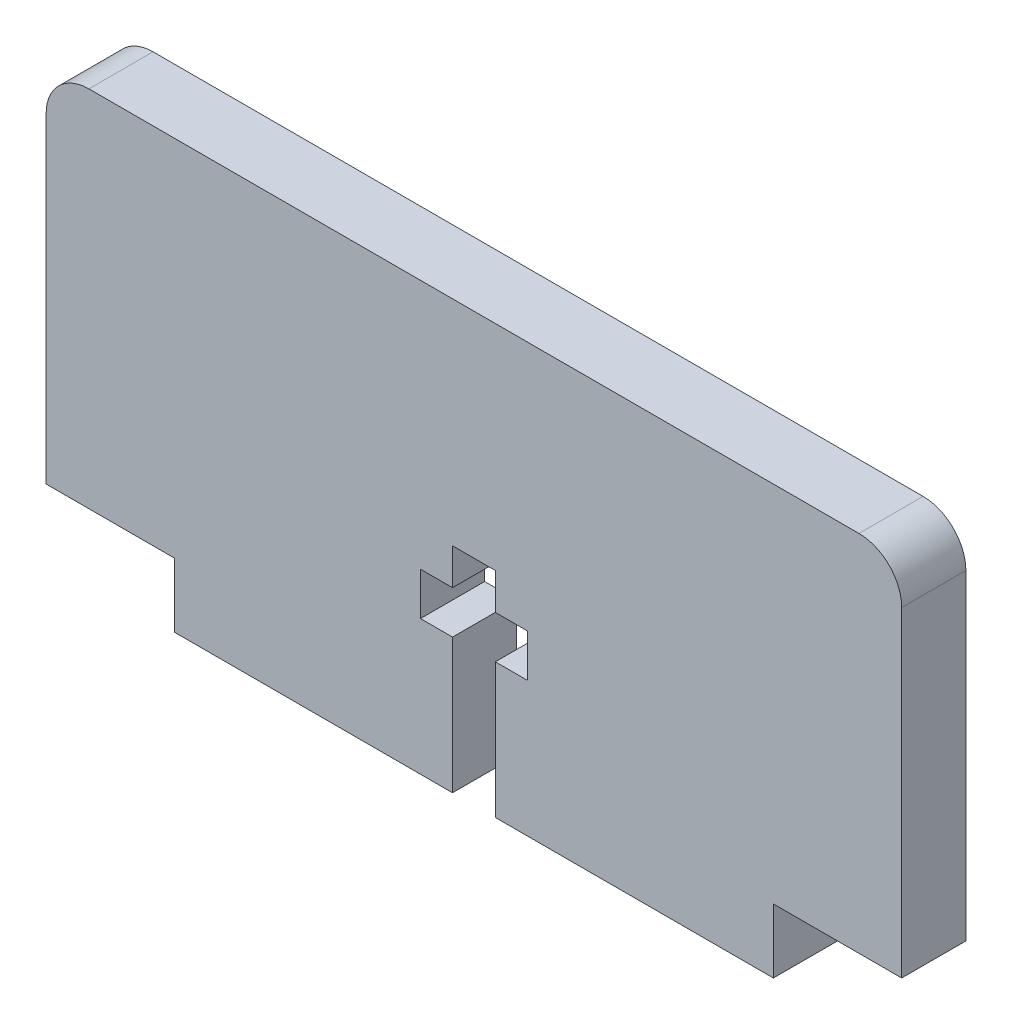
ISO-10303-21;
HEADER;
FILE_DESCRIPTION(('STEP AP214'),'2;1');
FILE_NAME('part.step','',(''),(''),'','','');
FILE_SCHEMA(('AUTOMOTIVE_DESIGN { 1 0 10303 214 1 1 1 1 }'));
ENDSEC;
DATA;
#1=APPLICATION_CONTEXT('core data for automotive mechanical design processes');
#2=APPLICATION_PROTOCOL_DEFINITION('international standard','automotive_design',2000,#1);
#3=PRODUCT_CONTEXT('',#1,'mechanical');
#4=PRODUCT('Part','Part','',(#3));
#5=PRODUCT_RELATED_PRODUCT_CATEGORY('part','',(#4));
#6=PRODUCT_DEFINITION_FORMATION('','',#4);
#7=PRODUCT_DEFINITION_CONTEXT('part definition',#1,'design');
#8=PRODUCT_DEFINITION('design','',#6,#7);
#9=PRODUCT_DEFINITION_SHAPE('','',#8);
#10=(LENGTH_UNIT() NAMED_UNIT(*) SI_UNIT(.MILLI.,.METRE.));
#11=(NAMED_UNIT(*) PLANE_ANGLE_UNIT() SI_UNIT($,.RADIAN.));
#12=(NAMED_UNIT(*) SI_UNIT($,.STERADIAN.) SOLID_ANGLE_UNIT());
#13=UNCERTAINTY_MEASURE_WITH_UNIT(LENGTH_MEASURE(1.E-05),#10,'distance_accuracy_value','');
#14=(GEOMETRIC_REPRESENTATION_CONTEXT(3) GLOBAL_UNCERTAINTY_ASSIGNED_CONTEXT((#13)) GLOBAL_UNIT_ASSIGNED_CONTEXT((#10,
#11,#12)) REPRESENTATION_CONTEXT('',''));
#15=CARTESIAN_POINT('',(0.,0.,0.));
#16=DIRECTION('',(0.,0.,1.));
#17=DIRECTION('',(1.,0.,0.));
#18=AXIS2_PLACEMENT_3D('',#15,#16,#17);
#19=CARTESIAN_POINT('',(-100.,0.,15.));
#20=DIRECTION('',(0.,1.,0.));
#21=DIRECTION('',(0.,0.,1.));
#22=AXIS2_PLACEMENT_3D('',#19,#20,#21);
#23=PLANE('',#22);
#24=DIRECTION('',(0.,0.,1.));
#25=VECTOR('',#24,1.);
#26=CARTESIAN_POINT('',(5.00000000000006,0.,0.));
#27=LINE('',#26,#25);
#28=CARTESIAN_POINT('',(5.00000000000006,0.,0.));
#29=VERTEX_POINT('',#28);
#30=CARTESIAN_POINT('',(5.00000000000006,0.,15.));
#31=VERTEX_POINT('',#30);
#32=EDGE_CURVE('E254',#29,#31,#27,.T.);
#33=ORIENTED_EDGE('',*,*,#32,.F.);
#34=DIRECTION('',(1.,0.,0.));
#35=VECTOR('',#34,1.);
#36=CARTESIAN_POINT('',(-100.,0.,0.));
#37=LINE('',#36,#35);
#38=CARTESIAN_POINT('',(70.,0.,0.));
#39=VERTEX_POINT('',#38);
#40=EDGE_CURVE('E340',#29,#39,#37,.T.);
#41=ORIENTED_EDGE('',*,*,#40,.T.);
#42=DIRECTION('',(0.,0.,1.));
#43=VECTOR('',#42,1.);
#44=CARTESIAN_POINT('',(70.,0.,0.));
#45=LINE('',#44,#43);
#46=CARTESIAN_POINT('',(70.,0.,15.));
#47=VERTEX_POINT('',#46);
#48=EDGE_CURVE('E235',#39,#47,#45,.T.);
#49=ORIENTED_EDGE('',*,*,#48,.T.);
#50=DIRECTION('',(1.,0.,0.));
#51=VECTOR('',#50,1.);
#52=CARTESIAN_POINT('',(-100.,0.,15.));
#53=LINE('',#52,#51);
#54=EDGE_CURVE('E324',#31,#47,#53,.T.);
#55=ORIENTED_EDGE('',*,*,#54,.F.);
#56=EDGE_LOOP('',(#33,#41,#49,#55));
#57=FACE_BOUND('',#56,.T.);
#58=ADVANCED_FACE('F56',(#57),#23,.F.);
#59=CARTESIAN_POINT('',(89.9999999999999,90.,15.));
#60=DIRECTION('',(0.,0.,1.));
#61=DIRECTION('',(1.,0.,0.));
#62=AXIS2_PLACEMENT_3D('',#59,#60,#61);
#63=PLANE('',#62);
#64=DIRECTION('',(0.,-1.,0.));
#65=VECTOR('',#64,1.);
#66=CARTESIAN_POINT('',(-4.99999999999995,50.,15.));
#67=LINE('',#66,#65);
#68=CARTESIAN_POINT('',(-4.99999999999994,31.5158472255241,15.));
#69=VERTEX_POINT('',#68);
#70=CARTESIAN_POINT('',(-4.99999999999994,0.,15.));
#71=VERTEX_POINT('',#70);
#72=EDGE_CURVE('E265',#69,#71,#67,.T.);
#73=ORIENTED_EDGE('',*,*,#72,.F.);
#74=DIRECTION('',(1.,0.,0.));
#75=VECTOR('',#74,1.);
#76=CARTESIAN_POINT('',(-12.4999999999999,31.5158472255241,15.));
#77=LINE('',#76,#75);
#78=CARTESIAN_POINT('',(-12.4999999999999,31.5158472255241,15.));
#79=VERTEX_POINT('',#78);
#80=EDGE_CURVE('E231',#79,#69,#77,.T.);
#81=ORIENTED_EDGE('',*,*,#80,.F.);
#82=DIRECTION('',(0.,-1.,0.));
#83=VECTOR('',#82,1.);
#84=CARTESIAN_POINT('',(-12.4999999999999,41.5158472255241,15.));
#85=LINE('',#84,#83);
#86=CARTESIAN_POINT('',(-12.4999999999999,41.5158472255241,15.));
#87=VERTEX_POINT('',#86);
#88=EDGE_CURVE('E209',#87,#79,#85,.T.);
#89=ORIENTED_EDGE('',*,*,#88,.F.);
#90=DIRECTION('',(1.,0.,0.));
#91=VECTOR('',#90,1.);
#92=CARTESIAN_POINT('',(-12.4999999999999,41.5158472255241,15.));
#93=LINE('',#92,#91);
#94=CARTESIAN_POINT('',(-4.99999999999995,41.5158472255241,15.));
#95=VERTEX_POINT('',#94);
#96=EDGE_CURVE('E220',#87,#95,#93,.T.);
#97=ORIENTED_EDGE('',*,*,#96,.T.);
#98=CARTESIAN_POINT('',(-4.99999999999995,50.,15.));
#99=VERTEX_POINT('',#98);
#100=EDGE_CURVE('E263',#99,#95,#67,.T.);
#101=ORIENTED_EDGE('',*,*,#100,.F.);
#102=DIRECTION('',(1.,0.,0.));
#103=VECTOR('',#102,1.);
#104=CARTESIAN_POINT('',(-4.99999999999995,50.,15.));
#105=LINE('',#104,#103);
#106=CARTESIAN_POINT('',(5.00000000000005,50.,15.));
#107=VERTEX_POINT('',#106);
#108=EDGE_CURVE('E217',#99,#107,#105,.T.);
#109=ORIENTED_EDGE('',*,*,#108,.T.);
#110=DIRECTION('',(0.,-1.,0.));
#111=VECTOR('',#110,1.);
#112=CARTESIAN_POINT('',(5.00000000000005,50.,15.));
#113=LINE('',#112,#111);
#114=CARTESIAN_POINT('',(5.00000000000005,41.5158472255241,15.));
#115=VERTEX_POINT('',#114);
#116=EDGE_CURVE('E267',#107,#115,#113,.T.);
#117=ORIENTED_EDGE('',*,*,#116,.T.);
#118=CARTESIAN_POINT('',(12.5000000000001,41.5158472255241,15.));
#119=VERTEX_POINT('',#118);
#120=EDGE_CURVE('E226',#115,#119,#93,.T.);
#121=ORIENTED_EDGE('',*,*,#120,.T.);
#122=DIRECTION('',(0.,-1.,0.));
#123=VECTOR('',#122,1.);
#124=CARTESIAN_POINT('',(12.5000000000001,41.5158472255241,15.));
#125=LINE('',#124,#123);
#126=CARTESIAN_POINT('',(12.5000000000001,31.5158472255241,15.));
#127=VERTEX_POINT('',#126);
#128=EDGE_CURVE('E389',#119,#127,#125,.T.);
#129=ORIENTED_EDGE('',*,*,#128,.T.);
#130=CARTESIAN_POINT('',(5.00000000000006,31.5158472255241,15.));
#131=VERTEX_POINT('',#130);
#132=EDGE_CURVE('E233',#131,#127,#77,.T.);
#133=ORIENTED_EDGE('',*,*,#132,.F.);
#134=EDGE_CURVE('E270',#131,#31,#113,.T.);
#135=ORIENTED_EDGE('',*,*,#134,.T.);
#136=ORIENTED_EDGE('',*,*,#54,.T.);
#137=DIRECTION('',(0.,-1.,0.));
#138=VECTOR('',#137,1.);
#139=CARTESIAN_POINT('',(70.,0.,15.));
#140=LINE('',#139,#138);
#141=CARTESIAN_POINT('',(70.,15.,15.));
#142=VERTEX_POINT('',#141);
#143=EDGE_CURVE('E285',#142,#47,#140,.T.);
#144=ORIENTED_EDGE('',*,*,#143,.F.);
#145=DIRECTION('',(1.,0.,0.));
#146=VECTOR('',#145,1.);
#147=CARTESIAN_POINT('',(0.,15.,15.));
#148=LINE('',#147,#146);
#149=CARTESIAN_POINT('',(100.,15.,15.));
#150=VERTEX_POINT('',#149);
#151=EDGE_CURVE('E288',#142,#150,#148,.T.);
#152=ORIENTED_EDGE('',*,*,#151,.T.);
#153=DIRECTION('',(0.,1.,0.));
#154=VECTOR('',#153,1.);
#155=CARTESIAN_POINT('',(100.,0.,15.));
#156=LINE('',#155,#154);
#157=CARTESIAN_POINT('',(99.9999999999999,90.,15.));
#158=VERTEX_POINT('',#157);
#159=EDGE_CURVE('E312',#150,#158,#156,.T.);
#160=ORIENTED_EDGE('',*,*,#159,.T.);
#161=CARTESIAN_POINT('',(89.9999999999999,90.,15.));
#162=DIRECTION('',(0.,0.,1.));
#163=DIRECTION('',(1.,0.,0.));
#164=AXIS2_PLACEMENT_3D('',#161,#162,#163);
#165=CIRCLE('',#164,9.99999999999999);
#166=CARTESIAN_POINT('',(89.9999999999999,100.,15.));
#167=VERTEX_POINT('',#166);
#168=EDGE_CURVE('E314',#158,#167,#165,.T.);
#169=ORIENTED_EDGE('',*,*,#168,.T.);
#170=DIRECTION('',(-1.,0.,0.));
#171=VECTOR('',#170,1.);
#172=CARTESIAN_POINT('',(89.9999999999999,100.,15.));
#173=LINE('',#172,#171);
#174=CARTESIAN_POINT('',(-89.9999999999999,100.,15.));
#175=VERTEX_POINT('',#174);
#176=EDGE_CURVE('E317',#167,#175,#173,.T.);
#177=ORIENTED_EDGE('',*,*,#176,.T.);
#178=CARTESIAN_POINT('',(-89.9999999999999,90.,15.));
#179=DIRECTION('',(0.,0.,1.));
#180=DIRECTION('',(-1.,0.,0.));
#181=AXIS2_PLACEMENT_3D('',#178,#179,#180);
#182=CIRCLE('',#181,9.99999999999999);
#183=CARTESIAN_POINT('',(-99.9999999999999,90.,15.));
#184=VERTEX_POINT('',#183);
#185=EDGE_CURVE('E319',#175,#184,#182,.T.);
#186=ORIENTED_EDGE('',*,*,#185,.T.);
#187=DIRECTION('',(0.,-1.,0.));
#188=VECTOR('',#187,1.);
#189=CARTESIAN_POINT('',(-99.9999999999999,75.4145188432739,15.));
#190=LINE('',#189,#188);
#191=CARTESIAN_POINT('',(-99.9999999999999,15.,15.));
#192=VERTEX_POINT('',#191);
#193=EDGE_CURVE('E321',#184,#192,#190,.T.);
#194=ORIENTED_EDGE('',*,*,#193,.T.);
#195=DIRECTION('',(-1.,0.,0.));
#196=VECTOR('',#195,1.);
#197=CARTESIAN_POINT('',(0.,15.,15.));
#198=LINE('',#197,#196);
#199=CARTESIAN_POINT('',(-69.9999999999999,15.,15.));
#200=VERTEX_POINT('',#199);
#201=EDGE_CURVE('E298',#200,#192,#198,.T.);
#202=ORIENTED_EDGE('',*,*,#201,.F.);
#203=DIRECTION('',(0.,-1.,0.));
#204=VECTOR('',#203,1.);
#205=CARTESIAN_POINT('',(-69.9999999999999,0.,15.));
#206=LINE('',#205,#204);
#207=CARTESIAN_POINT('',(-69.9999999999999,0.,15.));
#208=VERTEX_POINT('',#207);
#209=EDGE_CURVE('E291',#200,#208,#206,.T.);
#210=ORIENTED_EDGE('',*,*,#209,.T.);
#211=EDGE_CURVE('E325',#208,#71,#53,.T.);
#212=ORIENTED_EDGE('',*,*,#211,.T.);
#213=EDGE_LOOP('',(#73,#81,#89,#97,#101,#109,#117,#121,#129,#133,#135,#136,#144,#152,#160,#169,
#177,#186,#194,#202,#210,#212));
#214=FACE_BOUND('',#213,.T.);
#215=ADVANCED_FACE('F229',(#214),#63,.T.);
#216=CARTESIAN_POINT('',(89.9999999999999,90.,0.));
#217=DIRECTION('',(0.,0.,1.));
#218=DIRECTION('',(1.,0.,0.));
#219=AXIS2_PLACEMENT_3D('',#216,#217,#218);
#220=PLANE('',#219);
#221=DIRECTION('',(1.,0.,0.));
#222=VECTOR('',#221,1.);
#223=CARTESIAN_POINT('',(-12.4999999999999,31.5158472255241,0.));
#224=LINE('',#223,#222);
#225=CARTESIAN_POINT('',(-12.4999999999999,31.5158472255241,0.));
#226=VERTEX_POINT('',#225);
#227=CARTESIAN_POINT('',(-4.99999999999994,31.5158472255241,0.));
#228=VERTEX_POINT('',#227);
#229=EDGE_CURVE('E246',#226,#228,#224,.T.);
#230=ORIENTED_EDGE('',*,*,#229,.T.);
#231=DIRECTION('',(0.,-1.,0.));
#232=VECTOR('',#231,1.);
#233=CARTESIAN_POINT('',(-4.99999999999995,50.,0.));
#234=LINE('',#233,#232);
#235=CARTESIAN_POINT('',(-4.99999999999994,0.,0.));
#236=VERTEX_POINT('',#235);
#237=EDGE_CURVE('E275',#228,#236,#234,.T.);
#238=ORIENTED_EDGE('',*,*,#237,.T.);
#239=CARTESIAN_POINT('',(-69.9999999999999,0.,0.));
#240=VERTEX_POINT('',#239);
#241=EDGE_CURVE('E315',#240,#236,#37,.T.);
#242=ORIENTED_EDGE('',*,*,#241,.F.);
#243=DIRECTION('',(0.,-1.,0.));
#244=VECTOR('',#243,1.);
#245=CARTESIAN_POINT('',(-69.9999999999999,0.,0.));
#246=LINE('',#245,#244);
#247=CARTESIAN_POINT('',(-69.9999999999999,15.,0.));
#248=VERTEX_POINT('',#247);
#249=EDGE_CURVE('E295',#248,#240,#246,.T.);
#250=ORIENTED_EDGE('',*,*,#249,.F.);
#251=DIRECTION('',(-1.,0.,0.));
#252=VECTOR('',#251,1.);
#253=CARTESIAN_POINT('',(0.,15.,0.));
#254=LINE('',#253,#252);
#255=CARTESIAN_POINT('',(-100.,15.,0.));
#256=VERTEX_POINT('',#255);
#257=EDGE_CURVE('E297',#248,#256,#254,.T.);
#258=ORIENTED_EDGE('',*,*,#257,.T.);
#259=DIRECTION('',(0.,-1.,0.));
#260=VECTOR('',#259,1.);
#261=CARTESIAN_POINT('',(-100.,0.,0.));
#262=LINE('',#261,#260);
#263=CARTESIAN_POINT('',(-99.9999999999999,90.,0.));
#264=VERTEX_POINT('',#263);
#265=EDGE_CURVE('E337',#264,#256,#262,.T.);
#266=ORIENTED_EDGE('',*,*,#265,.F.);
#267=CARTESIAN_POINT('',(-89.9999999999999,90.,0.));
#268=DIRECTION('',(0.,0.,1.));
#269=DIRECTION('',(-1.,0.,0.));
#270=AXIS2_PLACEMENT_3D('',#267,#268,#269);
#271=CIRCLE('',#270,9.99999999999999);
#272=CARTESIAN_POINT('',(-89.9999999999999,100.,0.));
#273=VERTEX_POINT('',#272);
#274=EDGE_CURVE('E334',#273,#264,#271,.T.);
#275=ORIENTED_EDGE('',*,*,#274,.F.);
#276=DIRECTION('',(-1.,0.,0.));
#277=VECTOR('',#276,1.);
#278=CARTESIAN_POINT('',(89.9999999999999,100.,0.));
#279=LINE('',#278,#277);
#280=CARTESIAN_POINT('',(89.9999999999999,100.,0.));
#281=VERTEX_POINT('',#280);
#282=EDGE_CURVE('E332',#281,#273,#279,.T.);
#283=ORIENTED_EDGE('',*,*,#282,.F.);
#284=CARTESIAN_POINT('',(89.9999999999999,90.,0.));
#285=DIRECTION('',(0.,0.,1.));
#286=DIRECTION('',(1.,0.,0.));
#287=AXIS2_PLACEMENT_3D('',#284,#285,#286);
#288=CIRCLE('',#287,9.99999999999999);
#289=CARTESIAN_POINT('',(99.9999999999999,90.,0.));
#290=VERTEX_POINT('',#289);
#291=EDGE_CURVE('E330',#290,#281,#288,.T.);
#292=ORIENTED_EDGE('',*,*,#291,.F.);
#293=DIRECTION('',(0.,1.,0.));
#294=VECTOR('',#293,1.);
#295=CARTESIAN_POINT('',(99.9999999999999,75.4145188432739,0.));
#296=LINE('',#295,#294);
#297=CARTESIAN_POINT('',(99.9999999999999,15.,0.));
#298=VERTEX_POINT('',#297);
#299=EDGE_CURVE('E307',#298,#290,#296,.T.);
#300=ORIENTED_EDGE('',*,*,#299,.F.);
#301=DIRECTION('',(1.,0.,0.));
#302=VECTOR('',#301,1.);
#303=CARTESIAN_POINT('',(0.,15.,0.));
#304=LINE('',#303,#302);
#305=CARTESIAN_POINT('',(70.,15.,0.));
#306=VERTEX_POINT('',#305);
#307=EDGE_CURVE('E79',#306,#298,#304,.T.);
#308=ORIENTED_EDGE('',*,*,#307,.F.);
#309=DIRECTION('',(0.,-1.,0.));
#310=VECTOR('',#309,1.);
#311=CARTESIAN_POINT('',(70.,0.,0.));
#312=LINE('',#311,#310);
#313=EDGE_CURVE('E282',#306,#39,#312,.T.);
#314=ORIENTED_EDGE('',*,*,#313,.T.);
#315=ORIENTED_EDGE('',*,*,#40,.F.);
#316=DIRECTION('',(0.,-1.,0.));
#317=VECTOR('',#316,1.);
#318=CARTESIAN_POINT('',(5.00000000000005,50.,0.));
#319=LINE('',#318,#317);
#320=CARTESIAN_POINT('',(5.00000000000006,31.5158472255241,0.));
#321=VERTEX_POINT('',#320);
#322=EDGE_CURVE('E71',#321,#29,#319,.T.);
#323=ORIENTED_EDGE('',*,*,#322,.F.);
#324=CARTESIAN_POINT('',(12.5000000000001,31.5158472255241,0.));
#325=VERTEX_POINT('',#324);
#326=EDGE_CURVE('E249',#321,#325,#224,.T.);
#327=ORIENTED_EDGE('',*,*,#326,.T.);
#328=DIRECTION('',(0.,-1.,0.));
#329=VECTOR('',#328,1.);
#330=CARTESIAN_POINT('',(12.5000000000001,41.5158472255241,0.));
#331=LINE('',#330,#329);
#332=CARTESIAN_POINT('',(12.5000000000001,41.5158472255241,0.));
#333=VERTEX_POINT('',#332);
#334=EDGE_CURVE('E244',#333,#325,#331,.T.);
#335=ORIENTED_EDGE('',*,*,#334,.F.);
#336=DIRECTION('',(1.,0.,0.));
#337=VECTOR('',#336,1.);
#338=CARTESIAN_POINT('',(-12.4999999999999,41.5158472255241,0.));
#339=LINE('',#338,#337);
#340=CARTESIAN_POINT('',(5.00000000000005,41.5158472255241,0.));
#341=VERTEX_POINT('',#340);
#342=EDGE_CURVE('E242',#341,#333,#339,.T.);
#343=ORIENTED_EDGE('',*,*,#342,.F.);
#344=CARTESIAN_POINT('',(5.00000000000005,50.,0.));
#345=VERTEX_POINT('',#344);
#346=EDGE_CURVE('E276',#345,#341,#319,.T.);
#347=ORIENTED_EDGE('',*,*,#346,.F.);
#348=DIRECTION('',(1.,0.,0.));
#349=VECTOR('',#348,1.);
#350=CARTESIAN_POINT('',(-4.99999999999995,50.,0.));
#351=LINE('',#350,#349);
#352=CARTESIAN_POINT('',(-4.99999999999995,50.,0.));
#353=VERTEX_POINT('',#352);
#354=EDGE_CURVE('E266',#353,#345,#351,.T.);
#355=ORIENTED_EDGE('',*,*,#354,.F.);
#356=CARTESIAN_POINT('',(-4.99999999999995,41.5158472255241,0.));
#357=VERTEX_POINT('',#356);
#358=EDGE_CURVE('E262',#353,#357,#234,.T.);
#359=ORIENTED_EDGE('',*,*,#358,.T.);
#360=CARTESIAN_POINT('',(-12.4999999999999,41.5158472255241,0.));
#361=VERTEX_POINT('',#360);
#362=EDGE_CURVE('E240',#361,#357,#339,.T.);
#363=ORIENTED_EDGE('',*,*,#362,.F.);
#364=DIRECTION('',(0.,-1.,0.));
#365=VECTOR('',#364,1.);
#366=CARTESIAN_POINT('',(-12.4999999999999,41.5158472255241,0.));
#367=LINE('',#366,#365);
#368=EDGE_CURVE('E212',#361,#226,#367,.T.);
#369=ORIENTED_EDGE('',*,*,#368,.T.);
#370=EDGE_LOOP('',(#230,#238,#242,#250,#258,#266,#275,#283,#292,#300,#308,#314,#315,#323,#327,
#335,#343,#347,#355,#359,#363,#369));
#371=FACE_BOUND('',#370,.T.);
#372=ADVANCED_FACE('F359',(#371),#220,.F.);
#373=CARTESIAN_POINT('',(99.9999999999999,75.4145188432739,15.));
#374=DIRECTION('',(-1.,0.,0.));
#375=DIRECTION('',(0.,0.,1.));
#376=AXIS2_PLACEMENT_3D('',#373,#374,#375);
#377=PLANE('',#376);
#378=DIRECTION('',(0.,0.,1.));
#379=VECTOR('',#378,1.);
#380=CARTESIAN_POINT('',(100.,15.,0.));
#381=LINE('',#380,#379);
#382=EDGE_CURVE('E232',#298,#150,#381,.T.);
#383=ORIENTED_EDGE('',*,*,#382,.F.);
#384=ORIENTED_EDGE('',*,*,#299,.T.);
#385=DIRECTION('',(0.,0.,-1.));
#386=VECTOR('',#385,1.);
#387=CARTESIAN_POINT('',(99.9999999999999,90.,15.));
#388=LINE('',#387,#386);
#389=EDGE_CURVE('E12',#158,#290,#388,.T.);
#390=ORIENTED_EDGE('',*,*,#389,.F.);
#391=ORIENTED_EDGE('',*,*,#159,.F.);
#392=EDGE_LOOP('',(#383,#384,#390,#391));
#393=FACE_BOUND('',#392,.T.);
#394=ADVANCED_FACE('F58',(#393),#377,.F.);
#395=ORIENTED_EDGE('',*,*,#241,.T.);
#396=DIRECTION('',(0.,0.,1.));
#397=VECTOR('',#396,1.);
#398=CARTESIAN_POINT('',(-4.99999999999994,0.,0.));
#399=LINE('',#398,#397);
#400=EDGE_CURVE('E257',#236,#71,#399,.T.);
#401=ORIENTED_EDGE('',*,*,#400,.T.);
#402=ORIENTED_EDGE('',*,*,#211,.F.);
#403=DIRECTION('',(0.,0.,1.));
#404=VECTOR('',#403,1.);
#405=CARTESIAN_POINT('',(-69.9999999999999,0.,0.));
#406=LINE('',#405,#404);
#407=EDGE_CURVE('E305',#240,#208,#406,.T.);
#408=ORIENTED_EDGE('',*,*,#407,.F.);
#409=EDGE_LOOP('',(#395,#401,#402,#408));
#410=FACE_BOUND('',#409,.T.);
#411=ADVANCED_FACE('F432',(#410),#23,.F.);
#412=CARTESIAN_POINT('',(89.9999999999999,90.,15.));
#413=DIRECTION('',(0.,0.,-1.));
#414=DIRECTION('',(-1.,0.,0.));
#415=AXIS2_PLACEMENT_3D('',#412,#413,#414);
#416=CYLINDRICAL_SURFACE('',#415,9.99999999999999);
#417=ORIENTED_EDGE('',*,*,#291,.T.);
#418=DIRECTION('',(0.,0.,-1.));
#419=VECTOR('',#418,1.);
#420=CARTESIAN_POINT('',(89.9999999999999,100.,15.));
#421=LINE('',#420,#419);
#422=EDGE_CURVE('E64',#167,#281,#421,.T.);
#423=ORIENTED_EDGE('',*,*,#422,.F.);
#424=ORIENTED_EDGE('',*,*,#168,.F.);
#425=ORIENTED_EDGE('',*,*,#389,.T.);
#426=EDGE_LOOP('',(#417,#423,#424,#425));
#427=FACE_BOUND('',#426,.T.);
#428=ADVANCED_FACE('F371',(#427),#416,.T.);
#429=CARTESIAN_POINT('',(89.9999999999999,100.,15.));
#430=DIRECTION('',(0.,-1.,0.));
#431=DIRECTION('',(0.,0.,-1.));
#432=AXIS2_PLACEMENT_3D('',#429,#430,#431);
#433=PLANE('',#432);
#434=ORIENTED_EDGE('',*,*,#282,.T.);
#435=DIRECTION('',(0.,0.,-1.));
#436=VECTOR('',#435,1.);
#437=CARTESIAN_POINT('',(-89.9999999999999,100.,15.));
#438=LINE('',#437,#436);
#439=EDGE_CURVE('E345',#175,#273,#438,.T.);
#440=ORIENTED_EDGE('',*,*,#439,.F.);
#441=ORIENTED_EDGE('',*,*,#176,.F.);
#442=ORIENTED_EDGE('',*,*,#422,.T.);
#443=EDGE_LOOP('',(#434,#440,#441,#442));
#444=FACE_BOUND('',#443,.T.);
#445=ADVANCED_FACE('F352',(#444),#433,.F.);
#446=CARTESIAN_POINT('',(-89.9999999999999,90.,15.));
#447=DIRECTION('',(0.,0.,-1.));
#448=DIRECTION('',(-1.,0.,0.));
#449=AXIS2_PLACEMENT_3D('',#446,#447,#448);
#450=CYLINDRICAL_SURFACE('',#449,9.99999999999999);
#451=ORIENTED_EDGE('',*,*,#274,.T.);
#452=DIRECTION('',(0.,0.,-1.));
#453=VECTOR('',#452,1.);
#454=CARTESIAN_POINT('',(-99.9999999999999,90.,15.));
#455=LINE('',#454,#453);
#456=EDGE_CURVE('E328',#184,#264,#455,.T.);
#457=ORIENTED_EDGE('',*,*,#456,.F.);
#458=ORIENTED_EDGE('',*,*,#185,.F.);
#459=ORIENTED_EDGE('',*,*,#439,.T.);
#460=EDGE_LOOP('',(#451,#457,#458,#459));
#461=FACE_BOUND('',#460,.T.);
#462=ADVANCED_FACE('F363',(#461),#450,.T.);
#463=CARTESIAN_POINT('',(-100.,0.,15.));
#464=DIRECTION('',(1.,0.,0.));
#465=DIRECTION('',(0.,0.,-1.));
#466=AXIS2_PLACEMENT_3D('',#463,#464,#465);
#467=PLANE('',#466);
#468=ORIENTED_EDGE('',*,*,#265,.T.);
#469=DIRECTION('',(0.,0.,1.));
#470=VECTOR('',#469,1.);
#471=CARTESIAN_POINT('',(-99.9999999999999,15.,0.));
#472=LINE('',#471,#470);
#473=EDGE_CURVE('E308',#256,#192,#472,.T.);
#474=ORIENTED_EDGE('',*,*,#473,.T.);
#475=ORIENTED_EDGE('',*,*,#193,.F.);
#476=ORIENTED_EDGE('',*,*,#456,.T.);
#477=EDGE_LOOP('',(#468,#474,#475,#476));
#478=FACE_BOUND('',#477,.T.);
#479=ADVANCED_FACE('F367',(#478),#467,.F.);
#480=CARTESIAN_POINT('',(-69.9999999999999,0.,0.));
#481=DIRECTION('',(-1.,0.,0.));
#482=DIRECTION('',(0.,0.,1.));
#483=AXIS2_PLACEMENT_3D('',#480,#481,#482);
#484=PLANE('',#483);
#485=ORIENTED_EDGE('',*,*,#209,.F.);
#486=DIRECTION('',(0.,0.,1.));
#487=VECTOR('',#486,1.);
#488=CARTESIAN_POINT('',(-69.9999999999999,15.,0.));
#489=LINE('',#488,#487);
#490=EDGE_CURVE('E301',#248,#200,#489,.T.);
#491=ORIENTED_EDGE('',*,*,#490,.F.);
#492=ORIENTED_EDGE('',*,*,#249,.T.);
#493=ORIENTED_EDGE('',*,*,#407,.T.);
#494=EDGE_LOOP('',(#485,#491,#492,#493));
#495=FACE_BOUND('',#494,.T.);
#496=ADVANCED_FACE('F436',(#495),#484,.T.);
#497=CARTESIAN_POINT('',(0.,15.,0.));
#498=DIRECTION('',(0.,1.,0.));
#499=DIRECTION('',(-1.,0.,0.));
#500=AXIS2_PLACEMENT_3D('',#497,#498,#499);
#501=PLANE('',#500);
#502=ORIENTED_EDGE('',*,*,#201,.T.);
#503=ORIENTED_EDGE('',*,*,#473,.F.);
#504=ORIENTED_EDGE('',*,*,#257,.F.);
#505=ORIENTED_EDGE('',*,*,#490,.T.);
#506=EDGE_LOOP('',(#502,#503,#504,#505));
#507=FACE_BOUND('',#506,.T.);
#508=ADVANCED_FACE('F440',(#507),#501,.F.);
#509=CARTESIAN_POINT('',(0.,15.,0.));
#510=DIRECTION('',(0.,-1.,0.));
#511=DIRECTION('',(1.,0.,0.));
#512=AXIS2_PLACEMENT_3D('',#509,#510,#511);
#513=PLANE('',#512);
#514=ORIENTED_EDGE('',*,*,#151,.F.);
#515=DIRECTION('',(0.,0.,1.));
#516=VECTOR('',#515,1.);
#517=CARTESIAN_POINT('',(70.,15.,0.));
#518=LINE('',#517,#516);
#519=EDGE_CURVE('E280',#306,#142,#518,.T.);
#520=ORIENTED_EDGE('',*,*,#519,.F.);
#521=ORIENTED_EDGE('',*,*,#307,.T.);
#522=ORIENTED_EDGE('',*,*,#382,.T.);
#523=EDGE_LOOP('',(#514,#520,#521,#522));
#524=FACE_BOUND('',#523,.T.);
#525=ADVANCED_FACE('F442',(#524),#513,.T.);
#526=CARTESIAN_POINT('',(70.,0.,0.));
#527=DIRECTION('',(-1.,0.,0.));
#528=DIRECTION('',(0.,-1.,0.));
#529=AXIS2_PLACEMENT_3D('',#526,#527,#528);
#530=PLANE('',#529);
#531=ORIENTED_EDGE('',*,*,#143,.T.);
#532=ORIENTED_EDGE('',*,*,#48,.F.);
#533=ORIENTED_EDGE('',*,*,#313,.F.);
#534=ORIENTED_EDGE('',*,*,#519,.T.);
#535=EDGE_LOOP('',(#531,#532,#533,#534));
#536=FACE_BOUND('',#535,.T.);
#537=ADVANCED_FACE('F377',(#536),#530,.F.);
#538=CARTESIAN_POINT('',(-4.99999999999995,50.,0.));
#539=DIRECTION('',(-1.,0.,0.));
#540=DIRECTION('',(0.,-1.,0.));
#541=AXIS2_PLACEMENT_3D('',#538,#539,#540);
#542=PLANE('',#541);
#543=DIRECTION('',(0.,0.,1.));
#544=VECTOR('',#543,1.);
#545=CARTESIAN_POINT('',(-4.99999999999994,31.5158472255241,0.));
#546=LINE('',#545,#544);
#547=EDGE_CURVE('E255',#228,#69,#546,.T.);
#548=ORIENTED_EDGE('',*,*,#547,.T.);
#549=ORIENTED_EDGE('',*,*,#72,.T.);
#550=ORIENTED_EDGE('',*,*,#400,.F.);
#551=ORIENTED_EDGE('',*,*,#237,.F.);
#552=EDGE_LOOP('',(#548,#549,#550,#551));
#553=FACE_BOUND('',#552,.T.);
#554=ADVANCED_FACE('F429',(#553),#542,.F.);
#555=CARTESIAN_POINT('',(5.00000000000005,50.,0.));
#556=DIRECTION('',(-1.,0.,0.));
#557=DIRECTION('',(0.,-1.,0.));
#558=AXIS2_PLACEMENT_3D('',#555,#556,#557);
#559=PLANE('',#558);
#560=ORIENTED_EDGE('',*,*,#322,.T.);
#561=ORIENTED_EDGE('',*,*,#32,.T.);
#562=ORIENTED_EDGE('',*,*,#134,.F.);
#563=DIRECTION('',(0.,0.,1.));
#564=VECTOR('',#563,1.);
#565=CARTESIAN_POINT('',(5.00000000000006,31.5158472255241,0.));
#566=LINE('',#565,#564);
#567=EDGE_CURVE('E397',#321,#131,#566,.T.);
#568=ORIENTED_EDGE('',*,*,#567,.F.);
#569=EDGE_LOOP('',(#560,#561,#562,#568));
#570=FACE_BOUND('',#569,.T.);
#571=ADVANCED_FACE('F384',(#570),#559,.T.);
#572=ORIENTED_EDGE('',*,*,#358,.F.);
#573=DIRECTION('',(0.,0.,1.));
#574=VECTOR('',#573,1.);
#575=CARTESIAN_POINT('',(-4.99999999999995,50.,0.));
#576=LINE('',#575,#574);
#577=EDGE_CURVE('E260',#353,#99,#576,.T.);
#578=ORIENTED_EDGE('',*,*,#577,.T.);
#579=ORIENTED_EDGE('',*,*,#100,.T.);
#580=DIRECTION('',(0.,0.,1.));
#581=VECTOR('',#580,1.);
#582=CARTESIAN_POINT('',(-4.99999999999995,41.5158472255241,0.));
#583=LINE('',#582,#581);
#584=EDGE_CURVE('E222',#357,#95,#583,.T.);
#585=ORIENTED_EDGE('',*,*,#584,.F.);
#586=EDGE_LOOP('',(#572,#578,#579,#585));
#587=FACE_BOUND('',#586,.T.);
#588=ADVANCED_FACE('F421',(#587),#542,.F.);
#589=CARTESIAN_POINT('',(-4.99999999999995,50.,0.));
#590=DIRECTION('',(0.,-1.,0.));
#591=DIRECTION('',(0.,0.,-1.));
#592=AXIS2_PLACEMENT_3D('',#589,#590,#591);
#593=PLANE('',#592);
#594=ORIENTED_EDGE('',*,*,#108,.F.);
#595=ORIENTED_EDGE('',*,*,#577,.F.);
#596=ORIENTED_EDGE('',*,*,#354,.T.);
#597=DIRECTION('',(0.,0.,1.));
#598=VECTOR('',#597,1.);
#599=CARTESIAN_POINT('',(5.00000000000005,50.,0.));
#600=LINE('',#599,#598);
#601=EDGE_CURVE('E251',#345,#107,#600,.T.);
#602=ORIENTED_EDGE('',*,*,#601,.T.);
#603=EDGE_LOOP('',(#594,#595,#596,#602));
#604=FACE_BOUND('',#603,.T.);
#605=ADVANCED_FACE('F418',(#604),#593,.T.);
#606=DIRECTION('',(0.,0.,1.));
#607=VECTOR('',#606,1.);
#608=CARTESIAN_POINT('',(5.00000000000005,41.5158472255241,0.));
#609=LINE('',#608,#607);
#610=EDGE_CURVE('E409',#341,#115,#609,.T.);
#611=ORIENTED_EDGE('',*,*,#610,.T.);
#612=ORIENTED_EDGE('',*,*,#116,.F.);
#613=ORIENTED_EDGE('',*,*,#601,.F.);
#614=ORIENTED_EDGE('',*,*,#346,.T.);
#615=EDGE_LOOP('',(#611,#612,#613,#614));
#616=FACE_BOUND('',#615,.T.);
#617=ADVANCED_FACE('F415',(#616),#559,.T.);
#618=CARTESIAN_POINT('',(-12.4999999999999,41.5158472255241,0.));
#619=DIRECTION('',(-1.,0.,0.));
#620=DIRECTION('',(0.,0.,1.));
#621=AXIS2_PLACEMENT_3D('',#618,#619,#620);
#622=PLANE('',#621);
#623=ORIENTED_EDGE('',*,*,#88,.T.);
#624=DIRECTION('',(0.,0.,1.));
#625=VECTOR('',#624,1.);
#626=CARTESIAN_POINT('',(-12.4999999999999,31.5158472255241,0.));
#627=LINE('',#626,#625);
#628=EDGE_CURVE('E243',#226,#79,#627,.T.);
#629=ORIENTED_EDGE('',*,*,#628,.F.);
#630=ORIENTED_EDGE('',*,*,#368,.F.);
#631=DIRECTION('',(0.,0.,1.));
#632=VECTOR('',#631,1.);
#633=CARTESIAN_POINT('',(-12.4999999999999,41.5158472255241,0.));
#634=LINE('',#633,#632);
#635=EDGE_CURVE('E205',#361,#87,#634,.T.);
#636=ORIENTED_EDGE('',*,*,#635,.T.);
#637=EDGE_LOOP('',(#623,#629,#630,#636));
#638=FACE_BOUND('',#637,.T.);
#639=ADVANCED_FACE('F207',(#638),#622,.F.);
#640=CARTESIAN_POINT('',(-12.4999999999999,41.5158472255241,0.));
#641=DIRECTION('',(0.,-1.,0.));
#642=DIRECTION('',(0.,0.,-1.));
#643=AXIS2_PLACEMENT_3D('',#640,#641,#642);
#644=PLANE('',#643);
#645=ORIENTED_EDGE('',*,*,#584,.T.);
#646=ORIENTED_EDGE('',*,*,#96,.F.);
#647=ORIENTED_EDGE('',*,*,#635,.F.);
#648=ORIENTED_EDGE('',*,*,#362,.T.);
#649=EDGE_LOOP('',(#645,#646,#647,#648));
#650=FACE_BOUND('',#649,.T.);
#651=ADVANCED_FACE('F221',(#650),#644,.T.);
#652=CARTESIAN_POINT('',(-12.4999999999999,31.5158472255241,0.));
#653=DIRECTION('',(0.,-1.,0.));
#654=DIRECTION('',(0.,0.,-1.));
#655=AXIS2_PLACEMENT_3D('',#652,#653,#654);
#656=PLANE('',#655);
#657=ORIENTED_EDGE('',*,*,#229,.F.);
#658=ORIENTED_EDGE('',*,*,#628,.T.);
#659=ORIENTED_EDGE('',*,*,#80,.T.);
#660=ORIENTED_EDGE('',*,*,#547,.F.);
#661=EDGE_LOOP('',(#657,#658,#659,#660));
#662=FACE_BOUND('',#661,.T.);
#663=ADVANCED_FACE('F427',(#662),#656,.F.);
#664=ORIENTED_EDGE('',*,*,#342,.T.);
#665=DIRECTION('',(0.,0.,1.));
#666=VECTOR('',#665,1.);
#667=CARTESIAN_POINT('',(12.5000000000001,41.5158472255241,0.));
#668=LINE('',#667,#666);
#669=EDGE_CURVE('E216',#333,#119,#668,.T.);
#670=ORIENTED_EDGE('',*,*,#669,.T.);
#671=ORIENTED_EDGE('',*,*,#120,.F.);
#672=ORIENTED_EDGE('',*,*,#610,.F.);
#673=EDGE_LOOP('',(#664,#670,#671,#672));
#674=FACE_BOUND('',#673,.T.);
#675=ADVANCED_FACE('F408',(#674),#644,.T.);
#676=CARTESIAN_POINT('',(12.5000000000001,41.5158472255241,0.));
#677=DIRECTION('',(-1.,0.,0.));
#678=DIRECTION('',(0.,0.,1.));
#679=AXIS2_PLACEMENT_3D('',#676,#677,#678);
#680=PLANE('',#679);
#681=ORIENTED_EDGE('',*,*,#128,.F.);
#682=ORIENTED_EDGE('',*,*,#669,.F.);
#683=ORIENTED_EDGE('',*,*,#334,.T.);
#684=DIRECTION('',(0.,0.,1.));
#685=VECTOR('',#684,1.);
#686=CARTESIAN_POINT('',(12.5000000000001,31.5158472255241,0.));
#687=LINE('',#686,#685);
#688=EDGE_CURVE('E395',#325,#127,#687,.T.);
#689=ORIENTED_EDGE('',*,*,#688,.T.);
#690=EDGE_LOOP('',(#681,#682,#683,#689));
#691=FACE_BOUND('',#690,.T.);
#692=ADVANCED_FACE('F399',(#691),#680,.T.);
#693=ORIENTED_EDGE('',*,*,#567,.T.);
#694=ORIENTED_EDGE('',*,*,#132,.T.);
#695=ORIENTED_EDGE('',*,*,#688,.F.);
#696=ORIENTED_EDGE('',*,*,#326,.F.);
#697=EDGE_LOOP('',(#693,#694,#695,#696));
#698=FACE_BOUND('',#697,.T.);
#699=ADVANCED_FACE('F393',(#698),#656,.F.);
#700=CLOSED_SHELL('',(#58,#215,#372,#394,#411,#428,#445,#462,#479,#496,#508,#525,#537,#554,#571,
#588,#605,#617,#639,#651,#663,#675,#692,#699));
#701=MANIFOLD_SOLID_BREP('B2',#700);
#702=ADVANCED_BREP_SHAPE_REPRESENTATION('',(#18,#701),#14);
#703=SHAPE_DEFINITION_REPRESENTATION(#9,#702);
ENDSEC;
END-ISO-10303-21;
